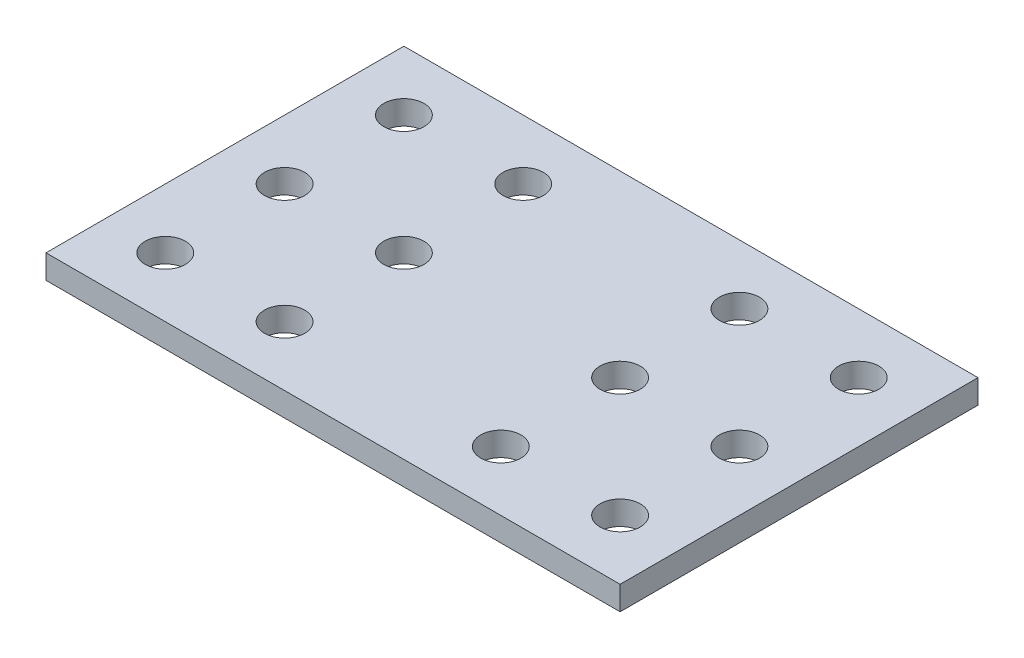
ISO-10303-21;
HEADER;
FILE_DESCRIPTION(('STEP AP214'),'2;1');
FILE_NAME('part.step','',(''),(''),'','','');
FILE_SCHEMA(('AUTOMOTIVE_DESIGN { 1 0 10303 214 1 1 1 1 }'));
ENDSEC;
DATA;
#1=APPLICATION_CONTEXT('core data for automotive mechanical design processes');
#2=APPLICATION_PROTOCOL_DEFINITION('international standard','automotive_design',2000,#1);
#3=PRODUCT_CONTEXT('',#1,'mechanical');
#4=PRODUCT('Part','Part','',(#3));
#5=PRODUCT_RELATED_PRODUCT_CATEGORY('part','',(#4));
#6=PRODUCT_DEFINITION_FORMATION('','',#4);
#7=PRODUCT_DEFINITION_CONTEXT('part definition',#1,'design');
#8=PRODUCT_DEFINITION('design','',#6,#7);
#9=PRODUCT_DEFINITION_SHAPE('','',#8);
#10=(LENGTH_UNIT() NAMED_UNIT(*) SI_UNIT(.MILLI.,.METRE.));
#11=(NAMED_UNIT(*) PLANE_ANGLE_UNIT() SI_UNIT($,.RADIAN.));
#12=(NAMED_UNIT(*) SI_UNIT($,.STERADIAN.) SOLID_ANGLE_UNIT());
#13=UNCERTAINTY_MEASURE_WITH_UNIT(LENGTH_MEASURE(1.E-05),#10,'distance_accuracy_value','');
#14=(GEOMETRIC_REPRESENTATION_CONTEXT(3) GLOBAL_UNCERTAINTY_ASSIGNED_CONTEXT((#13)) GLOBAL_UNIT_ASSIGNED_CONTEXT((#10,
#11,#12)) REPRESENTATION_CONTEXT('',''));
#15=CARTESIAN_POINT('',(0.,0.,0.));
#16=DIRECTION('',(0.,0.,1.));
#17=DIRECTION('',(1.,0.,0.));
#18=AXIS2_PLACEMENT_3D('',#15,#16,#17);
#19=CARTESIAN_POINT('',(0.,16.,0.));
#20=DIRECTION('',(1.,0.,0.));
#21=DIRECTION('',(0.,0.,-1.));
#22=AXIS2_PLACEMENT_3D('',#19,#20,#21);
#23=PLANE('',#22);
#24=DIRECTION('',(0.,0.,1.));
#25=VECTOR('',#24,1.);
#26=CARTESIAN_POINT('',(0.,0.,0.));
#27=LINE('',#26,#25);
#28=CARTESIAN_POINT('',(0.,0.,-240.));
#29=VERTEX_POINT('',#28);
#30=CARTESIAN_POINT('',(0.,0.,0.));
#31=VERTEX_POINT('',#30);
#32=EDGE_CURVE('E97',#29,#31,#27,.T.);
#33=ORIENTED_EDGE('',*,*,#32,.T.);
#34=DIRECTION('',(0.,-1.,0.));
#35=VECTOR('',#34,1.);
#36=CARTESIAN_POINT('',(0.,16.,0.));
#37=LINE('',#36,#35);
#38=CARTESIAN_POINT('',(0.,16.,0.));
#39=VERTEX_POINT('',#38);
#40=EDGE_CURVE('E11',#39,#31,#37,.T.);
#41=ORIENTED_EDGE('',*,*,#40,.F.);
#42=DIRECTION('',(0.,0.,1.));
#43=VECTOR('',#42,1.);
#44=CARTESIAN_POINT('',(0.,16.,0.));
#45=LINE('',#44,#43);
#46=CARTESIAN_POINT('',(0.,16.,-240.));
#47=VERTEX_POINT('',#46);
#48=EDGE_CURVE('E85',#47,#39,#45,.T.);
#49=ORIENTED_EDGE('',*,*,#48,.F.);
#50=DIRECTION('',(0.,-1.,0.));
#51=VECTOR('',#50,1.);
#52=CARTESIAN_POINT('',(0.,16.,-240.));
#53=LINE('',#52,#51);
#54=EDGE_CURVE('E93',#47,#29,#53,.T.);
#55=ORIENTED_EDGE('',*,*,#54,.T.);
#56=EDGE_LOOP('',(#33,#41,#49,#55));
#57=FACE_BOUND('',#56,.T.);
#58=ADVANCED_FACE('F34',(#57),#23,.F.);
#59=CARTESIAN_POINT('',(0.,16.,0.));
#60=DIRECTION('',(0.,0.,-1.));
#61=DIRECTION('',(-1.,0.,0.));
#62=AXIS2_PLACEMENT_3D('',#59,#60,#61);
#63=PLANE('',#62);
#64=DIRECTION('',(1.,0.,0.));
#65=VECTOR('',#64,1.);
#66=CARTESIAN_POINT('',(0.,0.,0.));
#67=LINE('',#66,#65);
#68=CARTESIAN_POINT('',(385.,0.,0.));
#69=VERTEX_POINT('',#68);
#70=EDGE_CURVE('E89',#31,#69,#67,.T.);
#71=ORIENTED_EDGE('',*,*,#70,.T.);
#72=DIRECTION('',(0.,-1.,0.));
#73=VECTOR('',#72,1.);
#74=CARTESIAN_POINT('',(385.,16.,0.));
#75=LINE('',#74,#73);
#76=CARTESIAN_POINT('',(385.,16.,0.));
#77=VERTEX_POINT('',#76);
#78=EDGE_CURVE('E42',#77,#69,#75,.T.);
#79=ORIENTED_EDGE('',*,*,#78,.F.);
#80=DIRECTION('',(1.,0.,0.));
#81=VECTOR('',#80,1.);
#82=CARTESIAN_POINT('',(0.,16.,0.));
#83=LINE('',#82,#81);
#84=EDGE_CURVE('E80',#39,#77,#83,.T.);
#85=ORIENTED_EDGE('',*,*,#84,.F.);
#86=ORIENTED_EDGE('',*,*,#40,.T.);
#87=EDGE_LOOP('',(#71,#79,#85,#86));
#88=FACE_BOUND('',#87,.T.);
#89=ADVANCED_FACE('F88',(#88),#63,.F.);
#90=CARTESIAN_POINT('',(385.,16.,0.));
#91=DIRECTION('',(-1.,0.,0.));
#92=DIRECTION('',(0.,0.,1.));
#93=AXIS2_PLACEMENT_3D('',#90,#91,#92);
#94=PLANE('',#93);
#95=DIRECTION('',(0.,0.,-1.));
#96=VECTOR('',#95,1.);
#97=CARTESIAN_POINT('',(385.,0.,0.));
#98=LINE('',#97,#96);
#99=CARTESIAN_POINT('',(385.,0.,-240.));
#100=VERTEX_POINT('',#99);
#101=EDGE_CURVE('E67',#69,#100,#98,.T.);
#102=ORIENTED_EDGE('',*,*,#101,.T.);
#103=DIRECTION('',(0.,-1.,0.));
#104=VECTOR('',#103,1.);
#105=CARTESIAN_POINT('',(385.,16.,-240.));
#106=LINE('',#105,#104);
#107=CARTESIAN_POINT('',(385.,16.,-240.));
#108=VERTEX_POINT('',#107);
#109=EDGE_CURVE('E90',#108,#100,#106,.T.);
#110=ORIENTED_EDGE('',*,*,#109,.F.);
#111=DIRECTION('',(0.,0.,-1.));
#112=VECTOR('',#111,1.);
#113=CARTESIAN_POINT('',(385.,16.,0.));
#114=LINE('',#113,#112);
#115=EDGE_CURVE('E83',#77,#108,#114,.T.);
#116=ORIENTED_EDGE('',*,*,#115,.F.);
#117=ORIENTED_EDGE('',*,*,#78,.T.);
#118=EDGE_LOOP('',(#102,#110,#116,#117));
#119=FACE_BOUND('',#118,.T.);
#120=ADVANCED_FACE('F91',(#119),#94,.F.);
#121=CARTESIAN_POINT('',(0.,16.,-240.));
#122=DIRECTION('',(0.,0.,1.));
#123=DIRECTION('',(1.,0.,0.));
#124=AXIS2_PLACEMENT_3D('',#121,#122,#123);
#125=PLANE('',#124);
#126=DIRECTION('',(-1.,0.,0.));
#127=VECTOR('',#126,1.);
#128=CARTESIAN_POINT('',(0.,0.,-240.));
#129=LINE('',#128,#127);
#130=EDGE_CURVE('E73',#100,#29,#129,.T.);
#131=ORIENTED_EDGE('',*,*,#130,.T.);
#132=ORIENTED_EDGE('',*,*,#54,.F.);
#133=DIRECTION('',(-1.,0.,0.));
#134=VECTOR('',#133,1.);
#135=CARTESIAN_POINT('',(0.,16.,-240.));
#136=LINE('',#135,#134);
#137=EDGE_CURVE('E50',#108,#47,#136,.T.);
#138=ORIENTED_EDGE('',*,*,#137,.F.);
#139=ORIENTED_EDGE('',*,*,#109,.T.);
#140=EDGE_LOOP('',(#131,#132,#138,#139));
#141=FACE_BOUND('',#140,.T.);
#142=ADVANCED_FACE('F105',(#141),#125,.F.);
#143=CARTESIAN_POINT('',(0.,16.,0.));
#144=DIRECTION('',(0.,-1.,0.));
#145=DIRECTION('',(0.,0.,-1.));
#146=AXIS2_PLACEMENT_3D('',#143,#144,#145);
#147=PLANE('',#146);
#148=CARTESIAN_POINT('',(265.,16.,-40.));
#149=DIRECTION('',(0.,1.,0.));
#150=DIRECTION('',(0.,0.,1.));
#151=AXIS2_PLACEMENT_3D('',#148,#149,#150);
#152=CIRCLE('',#151,13.5);
#153=CARTESIAN_POINT('',(265.,16.,-26.5));
#154=VERTEX_POINT('',#153);
#155=EDGE_CURVE('E177',#154,#154,#152,.T.);
#156=ORIENTED_EDGE('',*,*,#155,.F.);
#157=EDGE_LOOP('',(#156));
#158=FACE_BOUND('',#157,.T.);
#159=CARTESIAN_POINT('',(265.,16.,-200.));
#160=DIRECTION('',(0.,1.,0.));
#161=DIRECTION('',(0.,0.,1.));
#162=AXIS2_PLACEMENT_3D('',#159,#160,#161);
#163=CIRCLE('',#162,13.5);
#164=CARTESIAN_POINT('',(265.,16.,-186.5));
#165=VERTEX_POINT('',#164);
#166=EDGE_CURVE('E171',#165,#165,#163,.T.);
#167=ORIENTED_EDGE('',*,*,#166,.F.);
#168=EDGE_LOOP('',(#167));
#169=FACE_BOUND('',#168,.T.);
#170=CARTESIAN_POINT('',(265.,16.,-120.));
#171=DIRECTION('',(0.,1.,0.));
#172=DIRECTION('',(0.,0.,1.));
#173=AXIS2_PLACEMENT_3D('',#170,#171,#172);
#174=CIRCLE('',#173,13.5);
#175=CARTESIAN_POINT('',(265.,16.,-106.5));
#176=VERTEX_POINT('',#175);
#177=EDGE_CURVE('E165',#176,#176,#174,.T.);
#178=ORIENTED_EDGE('',*,*,#177,.F.);
#179=EDGE_LOOP('',(#178));
#180=FACE_BOUND('',#179,.T.);
#181=CARTESIAN_POINT('',(345.,16.,-40.));
#182=DIRECTION('',(0.,1.,0.));
#183=DIRECTION('',(0.,0.,1.));
#184=AXIS2_PLACEMENT_3D('',#181,#182,#183);
#185=CIRCLE('',#184,13.5);
#186=CARTESIAN_POINT('',(345.,16.,-26.5));
#187=VERTEX_POINT('',#186);
#188=EDGE_CURVE('E159',#187,#187,#185,.T.);
#189=ORIENTED_EDGE('',*,*,#188,.F.);
#190=EDGE_LOOP('',(#189));
#191=FACE_BOUND('',#190,.T.);
#192=CARTESIAN_POINT('',(345.,16.,-200.));
#193=DIRECTION('',(0.,1.,0.));
#194=DIRECTION('',(0.,0.,1.));
#195=AXIS2_PLACEMENT_3D('',#192,#193,#194);
#196=CIRCLE('',#195,13.5);
#197=CARTESIAN_POINT('',(345.,16.,-186.5));
#198=VERTEX_POINT('',#197);
#199=EDGE_CURVE('E153',#198,#198,#196,.T.);
#200=ORIENTED_EDGE('',*,*,#199,.F.);
#201=EDGE_LOOP('',(#200));
#202=FACE_BOUND('',#201,.T.);
#203=CARTESIAN_POINT('',(345.,16.,-120.));
#204=DIRECTION('',(0.,1.,0.));
#205=DIRECTION('',(0.,0.,1.));
#206=AXIS2_PLACEMENT_3D('',#203,#204,#205);
#207=CIRCLE('',#206,13.5);
#208=CARTESIAN_POINT('',(345.,16.,-106.5));
#209=VERTEX_POINT('',#208);
#210=EDGE_CURVE('E147',#209,#209,#207,.T.);
#211=ORIENTED_EDGE('',*,*,#210,.F.);
#212=EDGE_LOOP('',(#211));
#213=FACE_BOUND('',#212,.T.);
#214=CARTESIAN_POINT('',(40.,16.,-40.));
#215=DIRECTION('',(0.,1.,0.));
#216=DIRECTION('',(0.,0.,1.));
#217=AXIS2_PLACEMENT_3D('',#214,#215,#216);
#218=CIRCLE('',#217,13.5);
#219=CARTESIAN_POINT('',(40.,16.,-26.5));
#220=VERTEX_POINT('',#219);
#221=EDGE_CURVE('E141',#220,#220,#218,.T.);
#222=ORIENTED_EDGE('',*,*,#221,.F.);
#223=EDGE_LOOP('',(#222));
#224=FACE_BOUND('',#223,.T.);
#225=CARTESIAN_POINT('',(40.,16.,-200.));
#226=DIRECTION('',(0.,1.,0.));
#227=DIRECTION('',(0.,0.,1.));
#228=AXIS2_PLACEMENT_3D('',#225,#226,#227);
#229=CIRCLE('',#228,13.5);
#230=CARTESIAN_POINT('',(40.,16.,-186.5));
#231=VERTEX_POINT('',#230);
#232=EDGE_CURVE('E135',#231,#231,#229,.T.);
#233=ORIENTED_EDGE('',*,*,#232,.F.);
#234=EDGE_LOOP('',(#233));
#235=FACE_BOUND('',#234,.T.);
#236=CARTESIAN_POINT('',(40.,16.,-120.));
#237=DIRECTION('',(0.,1.,0.));
#238=DIRECTION('',(0.,0.,1.));
#239=AXIS2_PLACEMENT_3D('',#236,#237,#238);
#240=CIRCLE('',#239,13.5);
#241=CARTESIAN_POINT('',(40.,16.,-106.5));
#242=VERTEX_POINT('',#241);
#243=EDGE_CURVE('E129',#242,#242,#240,.T.);
#244=ORIENTED_EDGE('',*,*,#243,.F.);
#245=EDGE_LOOP('',(#244));
#246=FACE_BOUND('',#245,.T.);
#247=CARTESIAN_POINT('',(120.,16.,-40.));
#248=DIRECTION('',(0.,1.,0.));
#249=DIRECTION('',(0.,0.,1.));
#250=AXIS2_PLACEMENT_3D('',#247,#248,#249);
#251=CIRCLE('',#250,13.5);
#252=CARTESIAN_POINT('',(120.,16.,-26.5));
#253=VERTEX_POINT('',#252);
#254=EDGE_CURVE('E123',#253,#253,#251,.T.);
#255=ORIENTED_EDGE('',*,*,#254,.F.);
#256=EDGE_LOOP('',(#255));
#257=FACE_BOUND('',#256,.T.);
#258=CARTESIAN_POINT('',(120.,16.,-200.));
#259=DIRECTION('',(0.,1.,0.));
#260=DIRECTION('',(0.,0.,1.));
#261=AXIS2_PLACEMENT_3D('',#258,#259,#260);
#262=CIRCLE('',#261,13.5);
#263=CARTESIAN_POINT('',(120.,16.,-186.5));
#264=VERTEX_POINT('',#263);
#265=EDGE_CURVE('E117',#264,#264,#262,.T.);
#266=ORIENTED_EDGE('',*,*,#265,.F.);
#267=EDGE_LOOP('',(#266));
#268=FACE_BOUND('',#267,.T.);
#269=CARTESIAN_POINT('',(120.,16.,-120.));
#270=DIRECTION('',(0.,1.,0.));
#271=DIRECTION('',(0.,0.,1.));
#272=AXIS2_PLACEMENT_3D('',#269,#270,#271);
#273=CIRCLE('',#272,13.5);
#274=CARTESIAN_POINT('',(120.,16.,-106.5));
#275=VERTEX_POINT('',#274);
#276=EDGE_CURVE('E111',#275,#275,#273,.T.);
#277=ORIENTED_EDGE('',*,*,#276,.F.);
#278=EDGE_LOOP('',(#277));
#279=FACE_BOUND('',#278,.T.);
#280=ORIENTED_EDGE('',*,*,#48,.T.);
#281=ORIENTED_EDGE('',*,*,#84,.T.);
#282=ORIENTED_EDGE('',*,*,#115,.T.);
#283=ORIENTED_EDGE('',*,*,#137,.T.);
#284=EDGE_LOOP('',(#280,#281,#282,#283));
#285=FACE_BOUND('',#284,.T.);
#286=ADVANCED_FACE('F81',(#158,#169,#180,#191,#202,#213,#224,#235,#246,#257,#268,#279,#285),
#147,.F.);
#287=CARTESIAN_POINT('',(0.,0.,0.));
#288=DIRECTION('',(0.,-1.,0.));
#289=DIRECTION('',(0.,0.,-1.));
#290=AXIS2_PLACEMENT_3D('',#287,#288,#289);
#291=PLANE('',#290);
#292=CARTESIAN_POINT('',(265.,0.,-40.));
#293=DIRECTION('',(0.,1.,0.));
#294=DIRECTION('',(0.,0.,1.));
#295=AXIS2_PLACEMENT_3D('',#292,#293,#294);
#296=CIRCLE('',#295,13.5);
#297=CARTESIAN_POINT('',(265.,0.,-26.5));
#298=VERTEX_POINT('',#297);
#299=EDGE_CURVE('E174',#298,#298,#296,.T.);
#300=ORIENTED_EDGE('',*,*,#299,.T.);
#301=EDGE_LOOP('',(#300));
#302=FACE_BOUND('',#301,.T.);
#303=CARTESIAN_POINT('',(265.,0.,-200.));
#304=DIRECTION('',(0.,1.,0.));
#305=DIRECTION('',(0.,0.,1.));
#306=AXIS2_PLACEMENT_3D('',#303,#304,#305);
#307=CIRCLE('',#306,13.5);
#308=CARTESIAN_POINT('',(265.,0.,-186.5));
#309=VERTEX_POINT('',#308);
#310=EDGE_CURVE('E168',#309,#309,#307,.T.);
#311=ORIENTED_EDGE('',*,*,#310,.T.);
#312=EDGE_LOOP('',(#311));
#313=FACE_BOUND('',#312,.T.);
#314=CARTESIAN_POINT('',(265.,0.,-120.));
#315=DIRECTION('',(0.,1.,0.));
#316=DIRECTION('',(0.,0.,1.));
#317=AXIS2_PLACEMENT_3D('',#314,#315,#316);
#318=CIRCLE('',#317,13.5);
#319=CARTESIAN_POINT('',(265.,0.,-106.5));
#320=VERTEX_POINT('',#319);
#321=EDGE_CURVE('E162',#320,#320,#318,.T.);
#322=ORIENTED_EDGE('',*,*,#321,.T.);
#323=EDGE_LOOP('',(#322));
#324=FACE_BOUND('',#323,.T.);
#325=CARTESIAN_POINT('',(345.,0.,-40.));
#326=DIRECTION('',(0.,1.,0.));
#327=DIRECTION('',(0.,0.,1.));
#328=AXIS2_PLACEMENT_3D('',#325,#326,#327);
#329=CIRCLE('',#328,13.5);
#330=CARTESIAN_POINT('',(345.,0.,-26.5));
#331=VERTEX_POINT('',#330);
#332=EDGE_CURVE('E156',#331,#331,#329,.T.);
#333=ORIENTED_EDGE('',*,*,#332,.T.);
#334=EDGE_LOOP('',(#333));
#335=FACE_BOUND('',#334,.T.);
#336=CARTESIAN_POINT('',(345.,0.,-200.));
#337=DIRECTION('',(0.,1.,0.));
#338=DIRECTION('',(0.,0.,1.));
#339=AXIS2_PLACEMENT_3D('',#336,#337,#338);
#340=CIRCLE('',#339,13.5);
#341=CARTESIAN_POINT('',(345.,0.,-186.5));
#342=VERTEX_POINT('',#341);
#343=EDGE_CURVE('E150',#342,#342,#340,.T.);
#344=ORIENTED_EDGE('',*,*,#343,.T.);
#345=EDGE_LOOP('',(#344));
#346=FACE_BOUND('',#345,.T.);
#347=CARTESIAN_POINT('',(345.,0.,-120.));
#348=DIRECTION('',(0.,1.,0.));
#349=DIRECTION('',(0.,0.,1.));
#350=AXIS2_PLACEMENT_3D('',#347,#348,#349);
#351=CIRCLE('',#350,13.5);
#352=CARTESIAN_POINT('',(345.,0.,-106.5));
#353=VERTEX_POINT('',#352);
#354=EDGE_CURVE('E144',#353,#353,#351,.T.);
#355=ORIENTED_EDGE('',*,*,#354,.T.);
#356=EDGE_LOOP('',(#355));
#357=FACE_BOUND('',#356,.T.);
#358=CARTESIAN_POINT('',(40.,0.,-40.));
#359=DIRECTION('',(0.,1.,0.));
#360=DIRECTION('',(0.,0.,1.));
#361=AXIS2_PLACEMENT_3D('',#358,#359,#360);
#362=CIRCLE('',#361,13.5);
#363=CARTESIAN_POINT('',(40.,0.,-26.5));
#364=VERTEX_POINT('',#363);
#365=EDGE_CURVE('E138',#364,#364,#362,.T.);
#366=ORIENTED_EDGE('',*,*,#365,.T.);
#367=EDGE_LOOP('',(#366));
#368=FACE_BOUND('',#367,.T.);
#369=CARTESIAN_POINT('',(40.,0.,-200.));
#370=DIRECTION('',(0.,1.,0.));
#371=DIRECTION('',(0.,0.,1.));
#372=AXIS2_PLACEMENT_3D('',#369,#370,#371);
#373=CIRCLE('',#372,13.5);
#374=CARTESIAN_POINT('',(40.,0.,-186.5));
#375=VERTEX_POINT('',#374);
#376=EDGE_CURVE('E132',#375,#375,#373,.T.);
#377=ORIENTED_EDGE('',*,*,#376,.T.);
#378=EDGE_LOOP('',(#377));
#379=FACE_BOUND('',#378,.T.);
#380=CARTESIAN_POINT('',(40.,0.,-120.));
#381=DIRECTION('',(0.,1.,0.));
#382=DIRECTION('',(0.,0.,1.));
#383=AXIS2_PLACEMENT_3D('',#380,#381,#382);
#384=CIRCLE('',#383,13.5);
#385=CARTESIAN_POINT('',(40.,0.,-106.5));
#386=VERTEX_POINT('',#385);
#387=EDGE_CURVE('E126',#386,#386,#384,.T.);
#388=ORIENTED_EDGE('',*,*,#387,.T.);
#389=EDGE_LOOP('',(#388));
#390=FACE_BOUND('',#389,.T.);
#391=CARTESIAN_POINT('',(120.,0.,-40.));
#392=DIRECTION('',(0.,1.,0.));
#393=DIRECTION('',(0.,0.,1.));
#394=AXIS2_PLACEMENT_3D('',#391,#392,#393);
#395=CIRCLE('',#394,13.5);
#396=CARTESIAN_POINT('',(120.,0.,-26.5));
#397=VERTEX_POINT('',#396);
#398=EDGE_CURVE('E120',#397,#397,#395,.T.);
#399=ORIENTED_EDGE('',*,*,#398,.T.);
#400=EDGE_LOOP('',(#399));
#401=FACE_BOUND('',#400,.T.);
#402=CARTESIAN_POINT('',(120.,0.,-200.));
#403=DIRECTION('',(0.,1.,0.));
#404=DIRECTION('',(0.,0.,1.));
#405=AXIS2_PLACEMENT_3D('',#402,#403,#404);
#406=CIRCLE('',#405,13.5);
#407=CARTESIAN_POINT('',(120.,0.,-186.5));
#408=VERTEX_POINT('',#407);
#409=EDGE_CURVE('E114',#408,#408,#406,.T.);
#410=ORIENTED_EDGE('',*,*,#409,.T.);
#411=EDGE_LOOP('',(#410));
#412=FACE_BOUND('',#411,.T.);
#413=CARTESIAN_POINT('',(120.,0.,-120.));
#414=DIRECTION('',(0.,1.,0.));
#415=DIRECTION('',(0.,0.,1.));
#416=AXIS2_PLACEMENT_3D('',#413,#414,#415);
#417=CIRCLE('',#416,13.5);
#418=CARTESIAN_POINT('',(120.,0.,-106.5));
#419=VERTEX_POINT('',#418);
#420=EDGE_CURVE('E100',#419,#419,#417,.T.);
#421=ORIENTED_EDGE('',*,*,#420,.T.);
#422=EDGE_LOOP('',(#421));
#423=FACE_BOUND('',#422,.T.);
#424=ORIENTED_EDGE('',*,*,#32,.F.);
#425=ORIENTED_EDGE('',*,*,#130,.F.);
#426=ORIENTED_EDGE('',*,*,#101,.F.);
#427=ORIENTED_EDGE('',*,*,#70,.F.);
#428=EDGE_LOOP('',(#424,#425,#426,#427));
#429=FACE_BOUND('',#428,.T.);
#430=ADVANCED_FACE('F108',(#302,#313,#324,#335,#346,#357,#368,#379,#390,#401,#412,#423,#429),
#291,.T.);
#431=CARTESIAN_POINT('',(120.,0.,-120.));
#432=DIRECTION('',(0.,1.,0.));
#433=DIRECTION('',(0.,0.,1.));
#434=AXIS2_PLACEMENT_3D('',#431,#432,#433);
#435=CYLINDRICAL_SURFACE('',#434,13.5);
#436=ORIENTED_EDGE('',*,*,#420,.F.);
#437=EDGE_LOOP('',(#436));
#438=FACE_BOUND('',#437,.T.);
#439=ORIENTED_EDGE('',*,*,#276,.T.);
#440=EDGE_LOOP('',(#439));
#441=FACE_BOUND('',#440,.T.);
#442=ADVANCED_FACE('F217',(#438,#441),#435,.F.);
#443=CARTESIAN_POINT('',(120.,0.,-200.));
#444=DIRECTION('',(0.,1.,0.));
#445=DIRECTION('',(0.,0.,1.));
#446=AXIS2_PLACEMENT_3D('',#443,#444,#445);
#447=CYLINDRICAL_SURFACE('',#446,13.5);
#448=ORIENTED_EDGE('',*,*,#409,.F.);
#449=EDGE_LOOP('',(#448));
#450=FACE_BOUND('',#449,.T.);
#451=ORIENTED_EDGE('',*,*,#265,.T.);
#452=EDGE_LOOP('',(#451));
#453=FACE_BOUND('',#452,.T.);
#454=ADVANCED_FACE('F219',(#450,#453),#447,.F.);
#455=CARTESIAN_POINT('',(120.,0.,-40.));
#456=DIRECTION('',(0.,1.,0.));
#457=DIRECTION('',(0.,0.,1.));
#458=AXIS2_PLACEMENT_3D('',#455,#456,#457);
#459=CYLINDRICAL_SURFACE('',#458,13.5);
#460=ORIENTED_EDGE('',*,*,#398,.F.);
#461=EDGE_LOOP('',(#460));
#462=FACE_BOUND('',#461,.T.);
#463=ORIENTED_EDGE('',*,*,#254,.T.);
#464=EDGE_LOOP('',(#463));
#465=FACE_BOUND('',#464,.T.);
#466=ADVANCED_FACE('F226',(#462,#465),#459,.F.);
#467=CARTESIAN_POINT('',(40.,0.,-120.));
#468=DIRECTION('',(0.,1.,0.));
#469=DIRECTION('',(0.,0.,1.));
#470=AXIS2_PLACEMENT_3D('',#467,#468,#469);
#471=CYLINDRICAL_SURFACE('',#470,13.5);
#472=ORIENTED_EDGE('',*,*,#387,.F.);
#473=EDGE_LOOP('',(#472));
#474=FACE_BOUND('',#473,.T.);
#475=ORIENTED_EDGE('',*,*,#243,.T.);
#476=EDGE_LOOP('',(#475));
#477=FACE_BOUND('',#476,.T.);
#478=ADVANCED_FACE('F325',(#474,#477),#471,.F.);
#479=CARTESIAN_POINT('',(40.,0.,-200.));
#480=DIRECTION('',(0.,1.,0.));
#481=DIRECTION('',(0.,0.,1.));
#482=AXIS2_PLACEMENT_3D('',#479,#480,#481);
#483=CYLINDRICAL_SURFACE('',#482,13.5);
#484=ORIENTED_EDGE('',*,*,#376,.F.);
#485=EDGE_LOOP('',(#484));
#486=FACE_BOUND('',#485,.T.);
#487=ORIENTED_EDGE('',*,*,#232,.T.);
#488=EDGE_LOOP('',(#487));
#489=FACE_BOUND('',#488,.T.);
#490=ADVANCED_FACE('F321',(#486,#489),#483,.F.);
#491=CARTESIAN_POINT('',(40.,0.,-40.));
#492=DIRECTION('',(0.,1.,0.));
#493=DIRECTION('',(0.,0.,1.));
#494=AXIS2_PLACEMENT_3D('',#491,#492,#493);
#495=CYLINDRICAL_SURFACE('',#494,13.5);
#496=ORIENTED_EDGE('',*,*,#365,.F.);
#497=EDGE_LOOP('',(#496));
#498=FACE_BOUND('',#497,.T.);
#499=ORIENTED_EDGE('',*,*,#221,.T.);
#500=EDGE_LOOP('',(#499));
#501=FACE_BOUND('',#500,.T.);
#502=ADVANCED_FACE('F266',(#498,#501),#495,.F.);
#503=CARTESIAN_POINT('',(345.,0.,-120.));
#504=DIRECTION('',(0.,1.,0.));
#505=DIRECTION('',(0.,0.,1.));
#506=AXIS2_PLACEMENT_3D('',#503,#504,#505);
#507=CYLINDRICAL_SURFACE('',#506,13.5);
#508=ORIENTED_EDGE('',*,*,#354,.F.);
#509=EDGE_LOOP('',(#508));
#510=FACE_BOUND('',#509,.T.);
#511=ORIENTED_EDGE('',*,*,#210,.T.);
#512=EDGE_LOOP('',(#511));
#513=FACE_BOUND('',#512,.T.);
#514=ADVANCED_FACE('F260',(#510,#513),#507,.F.);
#515=CARTESIAN_POINT('',(345.,0.,-200.));
#516=DIRECTION('',(0.,1.,0.));
#517=DIRECTION('',(0.,0.,1.));
#518=AXIS2_PLACEMENT_3D('',#515,#516,#517);
#519=CYLINDRICAL_SURFACE('',#518,13.5);
#520=ORIENTED_EDGE('',*,*,#343,.F.);
#521=EDGE_LOOP('',(#520));
#522=FACE_BOUND('',#521,.T.);
#523=ORIENTED_EDGE('',*,*,#199,.T.);
#524=EDGE_LOOP('',(#523));
#525=FACE_BOUND('',#524,.T.);
#526=ADVANCED_FACE('F265',(#522,#525),#519,.F.);
#527=CARTESIAN_POINT('',(345.,0.,-40.));
#528=DIRECTION('',(0.,1.,0.));
#529=DIRECTION('',(0.,0.,1.));
#530=AXIS2_PLACEMENT_3D('',#527,#528,#529);
#531=CYLINDRICAL_SURFACE('',#530,13.5);
#532=ORIENTED_EDGE('',*,*,#332,.F.);
#533=EDGE_LOOP('',(#532));
#534=FACE_BOUND('',#533,.T.);
#535=ORIENTED_EDGE('',*,*,#188,.T.);
#536=EDGE_LOOP('',(#535));
#537=FACE_BOUND('',#536,.T.);
#538=ADVANCED_FACE('F278',(#534,#537),#531,.F.);
#539=CARTESIAN_POINT('',(265.,0.,-120.));
#540=DIRECTION('',(0.,1.,0.));
#541=DIRECTION('',(0.,0.,1.));
#542=AXIS2_PLACEMENT_3D('',#539,#540,#541);
#543=CYLINDRICAL_SURFACE('',#542,13.5);
#544=ORIENTED_EDGE('',*,*,#321,.F.);
#545=EDGE_LOOP('',(#544));
#546=FACE_BOUND('',#545,.T.);
#547=ORIENTED_EDGE('',*,*,#177,.T.);
#548=EDGE_LOOP('',(#547));
#549=FACE_BOUND('',#548,.T.);
#550=ADVANCED_FACE('F288',(#546,#549),#543,.F.);
#551=CARTESIAN_POINT('',(265.,0.,-200.));
#552=DIRECTION('',(0.,1.,0.));
#553=DIRECTION('',(0.,0.,1.));
#554=AXIS2_PLACEMENT_3D('',#551,#552,#553);
#555=CYLINDRICAL_SURFACE('',#554,13.5);
#556=ORIENTED_EDGE('',*,*,#310,.F.);
#557=EDGE_LOOP('',(#556));
#558=FACE_BOUND('',#557,.T.);
#559=ORIENTED_EDGE('',*,*,#166,.T.);
#560=EDGE_LOOP('',(#559));
#561=FACE_BOUND('',#560,.T.);
#562=ADVANCED_FACE('F188',(#558,#561),#555,.F.);
#563=CARTESIAN_POINT('',(265.,0.,-40.));
#564=DIRECTION('',(0.,1.,0.));
#565=DIRECTION('',(0.,0.,1.));
#566=AXIS2_PLACEMENT_3D('',#563,#564,#565);
#567=CYLINDRICAL_SURFACE('',#566,13.5);
#568=ORIENTED_EDGE('',*,*,#299,.F.);
#569=EDGE_LOOP('',(#568));
#570=FACE_BOUND('',#569,.T.);
#571=ORIENTED_EDGE('',*,*,#155,.T.);
#572=EDGE_LOOP('',(#571));
#573=FACE_BOUND('',#572,.T.);
#574=ADVANCED_FACE('F185',(#570,#573),#567,.F.);
#575=CLOSED_SHELL('',(#58,#89,#120,#142,#286,#430,#442,#454,#466,#478,#490,#502,#514,#526,#538,
#550,#562,#574));
#576=MANIFOLD_SOLID_BREP('B2',#575);
#577=ADVANCED_BREP_SHAPE_REPRESENTATION('',(#18,#576),#14);
#578=SHAPE_DEFINITION_REPRESENTATION(#9,#577);
ENDSEC;
END-ISO-10303-21;
